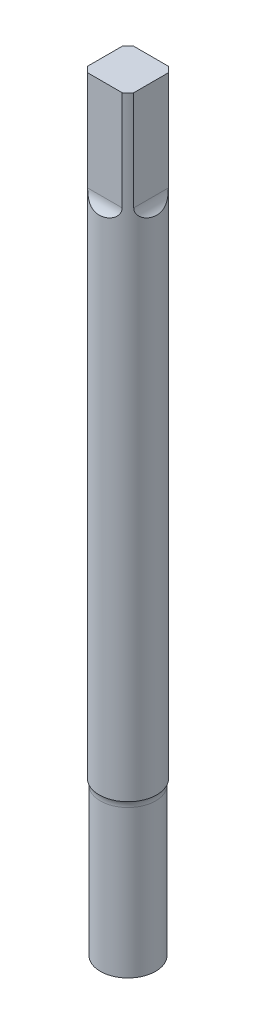
ISO-10303-21;
HEADER;
FILE_DESCRIPTION(('STEP AP214'),'2;1');
FILE_NAME('part.step','',(''),(''),'','','');
FILE_SCHEMA(('AUTOMOTIVE_DESIGN { 1 0 10303 214 1 1 1 1 }'));
ENDSEC;
DATA;
#1=APPLICATION_CONTEXT('core data for automotive mechanical design processes');
#2=APPLICATION_PROTOCOL_DEFINITION('international standard','automotive_design',2000,#1);
#3=PRODUCT_CONTEXT('',#1,'mechanical');
#4=PRODUCT('Part','Part','',(#3));
#5=PRODUCT_RELATED_PRODUCT_CATEGORY('part','',(#4));
#6=PRODUCT_DEFINITION_FORMATION('','',#4);
#7=PRODUCT_DEFINITION_CONTEXT('part definition',#1,'design');
#8=PRODUCT_DEFINITION('design','',#6,#7);
#9=PRODUCT_DEFINITION_SHAPE('','',#8);
#10=(LENGTH_UNIT() NAMED_UNIT(*) SI_UNIT(.MILLI.,.METRE.));
#11=(NAMED_UNIT(*) PLANE_ANGLE_UNIT() SI_UNIT($,.RADIAN.));
#12=(NAMED_UNIT(*) SI_UNIT($,.STERADIAN.) SOLID_ANGLE_UNIT());
#13=UNCERTAINTY_MEASURE_WITH_UNIT(LENGTH_MEASURE(1.E-05),#10,'distance_accuracy_value','');
#14=(GEOMETRIC_REPRESENTATION_CONTEXT(3) GLOBAL_UNCERTAINTY_ASSIGNED_CONTEXT((#13)) GLOBAL_UNIT_ASSIGNED_CONTEXT((#10,
#11,#12)) REPRESENTATION_CONTEXT('',''));
#15=CARTESIAN_POINT('',(0.,0.,0.));
#16=DIRECTION('',(0.,0.,1.));
#17=DIRECTION('',(1.,0.,0.));
#18=AXIS2_PLACEMENT_3D('',#15,#16,#17);
#19=CARTESIAN_POINT('',(-1.52655665885959E-13,-101.600000000001,0.));
#20=DIRECTION('',(0.,0.999999999999995,0.));
#21=DIRECTION('',(0.,0.,0.999999999999994));
#22=AXIS2_PLACEMENT_3D('',#19,#20,#21);
#23=CYLINDRICAL_SURFACE('',#22,4.7625);
#24=DIRECTION('',(0.,0.999999999999995,0.));
#25=VECTOR('',#24,1.);
#26=CARTESIAN_POINT('',(3.81000000000037,-101.599999999999,2.8574999999994));
#27=LINE('',#26,#25);
#28=CARTESIAN_POINT('',(3.81000000000195,4.16333634234434E-12,2.85749999999835));
#29=VERTEX_POINT('',#28);
#30=CARTESIAN_POINT('',(3.80999999999877,-16.510000000001,2.85749999999874));
#31=VERTEX_POINT('',#30);
#32=EDGE_CURVE('E178',#29,#31,#27,.F.);
#33=ORIENTED_EDGE('',*,*,#32,.F.);
#34=CARTESIAN_POINT('',(0.,0.,0.));
#35=DIRECTION('',(0.,0.999999999999995,0.));
#36=DIRECTION('',(0.,0.,0.999999999999994));
#37=AXIS2_PLACEMENT_3D('',#34,#35,#36);
#38=CIRCLE('',#37,4.7625);
#39=CARTESIAN_POINT('',(2.85749999999975,-2.77555756156289E-13,3.80999999999831));
#40=VERTEX_POINT('',#39);
#41=EDGE_CURVE('E145',#40,#29,#38,.T.);
#42=ORIENTED_EDGE('',*,*,#41,.F.);
#43=DIRECTION('',(0.,0.999999999999995,0.));
#44=VECTOR('',#43,1.);
#45=CARTESIAN_POINT('',(2.85749999999924,-101.6,3.80999999999904));
#46=LINE('',#45,#44);
#47=CARTESIAN_POINT('',(2.85749999999982,-16.5100000000001,3.81000000000004));
#48=VERTEX_POINT('',#47);
#49=EDGE_CURVE('E175',#48,#40,#46,.T.);
#50=ORIENTED_EDGE('',*,*,#49,.F.);
#51=CARTESIAN_POINT('',(2.85749999999982,-16.5100000000001,3.81000000000004));
#52=CARTESIAN_POINT('',(2.857504477416,-16.5570812641669,3.80998889247939));
#53=CARTESIAN_POINT('',(2.85575475834825,-16.6041575472771,3.81130874293111));
#54=CARTESIAN_POINT('',(2.84878240778673,-16.6978911993434,3.81652717100853));
#55=CARTESIAN_POINT('',(2.84356107098717,-16.7445487179003,3.82042478728745));
#56=CARTESIAN_POINT('',(2.82971803597565,-16.8368241429391,3.83068815279294));
#57=CARTESIAN_POINT('',(2.82111467374272,-16.882446275046,3.83704058987169));
#58=CARTESIAN_POINT('',(2.80058411548353,-16.9725362185548,3.85205088614253));
#59=CARTESIAN_POINT('',(2.78865679192644,-17.0170039855954,3.86070883378988));
#60=CARTESIAN_POINT('',(2.74803670210216,-17.148095208299,3.88983544368361));
#61=CARTESIAN_POINT('',(2.71448015022048,-17.232576406293,3.91347681240542));
#62=CARTESIAN_POINT('',(2.63547730925202,-17.3935415141389,3.96710566305349));
#63=CARTESIAN_POINT('',(2.59002163316283,-17.4700190430684,3.99709815167741));
#64=CARTESIAN_POINT('',(2.48813365815304,-17.6144514591364,4.06131136988517));
#65=CARTESIAN_POINT('',(2.43160037741213,-17.6823176829736,4.09556985252247));
#66=CARTESIAN_POINT('',(2.3094307174003,-17.8082889539501,4.16568000215951));
#67=CARTESIAN_POINT('',(2.24379161008309,-17.8663910642455,4.2015321444136));
#68=CARTESIAN_POINT('',(2.1225791340994,-17.9596258934155,4.26373886289992));
#69=CARTESIAN_POINT('',(2.06864738803728,-17.9968544750094,4.29020640349718));
#70=CARTESIAN_POINT('',(1.95721344300889,-18.0663194666636,4.34217852643301));
#71=CARTESIAN_POINT('',(1.89970987800982,-18.0985539500697,4.36768273427602));
#72=CARTESIAN_POINT('',(1.72242975744331,-18.1884107808562,4.44195724000351));
#73=CARTESIAN_POINT('',(1.59806065086234,-18.2390555435753,4.4883964231077));
#74=CARTESIAN_POINT('',(1.38489450345278,-18.3100971181266,4.55757618934135));
#75=CARTESIAN_POINT('',(1.2983430777971,-18.3349268359907,4.58301185432091));
#76=CARTESIAN_POINT('',(1.12246328205685,-18.3785692621857,4.62922574310534));
#77=CARTESIAN_POINT('',(1.03313379041925,-18.3973795048236,4.65000205731038));
#78=CARTESIAN_POINT('',(0.852638368672784,-18.4295877609794,4.68645810438564));
#79=CARTESIAN_POINT('',(0.761475219115703,-18.4429934031765,4.70214501487512));
#80=CARTESIAN_POINT('',(0.577855823978592,-18.4649235869099,4.72822175220419));
#81=CARTESIAN_POINT('',(0.485400190984095,-18.4734503655098,4.73861400651746));
#82=CARTESIAN_POINT('',(0.327396798143697,-18.4840898462187,4.75168378969452));
#83=CARTESIAN_POINT('',(0.262034196139407,-18.487356412568,4.75573706929774));
#84=CARTESIAN_POINT('',(0.1311172335869,-18.4917046459359,4.76114566370127));
#85=CARTESIAN_POINT('',(0.0655628466382996,-18.4927859964594,4.7625005876856));
#86=CARTESIAN_POINT('',(-0.108014055120613,-18.4927882945611,4.7624990317909));
#87=CARTESIAN_POINT('',(-0.216051071695446,-18.4898570581697,4.7588189076092));
#88=CARTESIAN_POINT('',(-0.431358801819971,-18.4779796748547,4.74415354679155));
#89=CARTESIAN_POINT('',(-0.538628954476402,-18.4690295060374,4.73316342561711));
#90=CARTESIAN_POINT('',(-0.75162904381935,-18.444628938568,4.70404269080407));
#91=CARTESIAN_POINT('',(-0.857356559797231,-18.4291692669451,4.68590189318812));
#92=CARTESIAN_POINT('',(-1.06601494560044,-18.3910048034972,4.64288511417884));
#93=CARTESIAN_POINT('',(-1.16894743498945,-18.3683043089281,4.61801312890844));
#94=CARTESIAN_POINT('',(-1.40769241509819,-18.3048244003388,4.55193436506253));
#95=CARTESIAN_POINT('',(-1.54189450629578,-18.2604742319646,4.5080746977329));
#96=CARTESIAN_POINT('',(-1.73472014064091,-18.18001768096,4.43586510863972));
#97=CARTESIAN_POINT('',(-1.79754152387835,-18.1509021262233,4.41074500504122));
#98=CARTESIAN_POINT('',(-1.919860722244,-18.0875838933927,4.35889270380213));
#99=CARTESIAN_POINT('',(-1.97935937798512,-18.0533825100498,4.33216091749083));
#100=CARTESIAN_POINT('',(-2.12555288862533,-17.9594702155585,4.26298189144815));
#101=CARTESIAN_POINT('',(-2.20955602255195,-17.895965882345,4.21985318770403));
#102=CARTESIAN_POINT('',(-2.36541694213501,-17.7549597236629,4.13450180594256));
#103=CARTESIAN_POINT('',(-2.4372873082592,-17.6774725716812,4.092278229568));
#104=CARTESIAN_POINT('',(-2.55586905469231,-17.5222061092004,4.01908116910294));
#105=CARTESIAN_POINT('',(-2.60476464435892,-17.4464419139193,3.98738722769704));
#106=CARTESIAN_POINT('',(-2.69053460712313,-17.2862352152797,3.93002591348936));
#107=CARTESIAN_POINT('',(-2.72741121598902,-17.2017943298055,3.90435742008383));
#108=CARTESIAN_POINT('',(-2.78539759302758,-17.0336176150615,3.86317583482228));
#109=CARTESIAN_POINT('',(-2.80756549945439,-16.950409874321,3.84699451596426));
#110=CARTESIAN_POINT('',(-2.84013531139345,-16.7806679238547,3.82301855081235));
#111=CARTESIAN_POINT('',(-2.85056244829104,-16.6941412623318,3.81520592163503));
#112=CARTESIAN_POINT('',(-2.85667547785698,-16.5748485672803,3.81061562883092));
#113=CARTESIAN_POINT('',(-2.85750568579378,-16.5424159955289,3.80998984431668));
#114=CARTESIAN_POINT('',(-2.85750000000046,-16.5099999999989,3.80999999999976));
#115=B_SPLINE_CURVE_WITH_KNOTS('',3,(#51,#52,#53,#54,#55,#56,#57,#58,#59,#60,#61,#62,#63,#64,
#65,#66,#67,#68,#69,#70,#71,#72,#73,#74,#75,#76,#77,#78,#79,#80,#81,#82,#83,#84,#85,#86,#87,#88,
#89,#90,#91,#92,#93,#94,#95,#96,#97,#98,#99,#100,#101,#102,#103,#104,#105,#106,#107,#108,#109,
#110,#111,#112,#113,#114),.UNSPECIFIED.,.F.,.F.,(4,2,2,2,2,2,2,2,2,2,2,2,2,2,2,2,2,2,2,2,2,2,2,
2,2,2,2,2,2,2,2,4),(0.,0.14118451266999,0.282316401941555,0.422693456200613,0.563075897064933,
0.843329389965566,1.1238046395233,1.40696677347145,1.69021392489678,1.90196181184655,
2.11379118587918,2.53815784700152,2.81856048269996,3.0990778301371,3.37919782481325,
3.65918927531442,3.85581011698062,4.05245943413083,4.37643698042298,4.70063122621408,
5.0252888666991,5.34975418798577,5.79186482315888,6.01261209991824,6.23330327470561,
6.57333338209456,6.91300871729004,7.19854355905399,7.48402525533128,7.74570724153362,
8.00682578286032,8.10410271681981),.UNSPECIFIED.);
#116=CARTESIAN_POINT('',(-2.85749999999894,-16.5099999999994,3.81000000000004));
#117=VERTEX_POINT('',#116);
#118=EDGE_CURVE('E51',#48,#117,#115,.T.);
#119=ORIENTED_EDGE('',*,*,#118,.T.);
#120=DIRECTION('',(0.,0.999999999999995,0.));
#121=VECTOR('',#120,1.);
#122=CARTESIAN_POINT('',(-2.85750000000008,-101.599999999999,3.81000000000059));
#123=LINE('',#122,#121);
#124=CARTESIAN_POINT('',(-2.85750000000118,2.22044604925031E-12,3.80999999999976));
#125=VERTEX_POINT('',#124);
#126=EDGE_CURVE('E172',#125,#117,#123,.F.);
#127=ORIENTED_EDGE('',*,*,#126,.F.);
#128=CARTESIAN_POINT('',(-3.81000000000042,-4.44089209850063E-13,2.85749999999796));
#129=VERTEX_POINT('',#128);
#130=EDGE_CURVE('E143',#129,#125,#38,.T.);
#131=ORIENTED_EDGE('',*,*,#130,.F.);
#132=DIRECTION('',(0.,0.999999999999995,0.));
#133=VECTOR('',#132,1.);
#134=CARTESIAN_POINT('',(-3.81000000000106,-101.600000000001,2.85749999999735));
#135=LINE('',#134,#133);
#136=CARTESIAN_POINT('',(-3.81000000000122,-16.5099999999989,2.85749999999779));
#137=VERTEX_POINT('',#136);
#138=EDGE_CURVE('E121',#137,#129,#135,.T.);
#139=ORIENTED_EDGE('',*,*,#138,.F.);
#140=CARTESIAN_POINT('',(-3.81000000000122,-16.5099999999989,2.85749999999779));
#141=CARTESIAN_POINT('',(-3.80998889248156,-16.5570812641658,2.85750447741345));
#142=CARTESIAN_POINT('',(-3.81130874293362,-16.6041575472763,2.85575475834562));
#143=CARTESIAN_POINT('',(-3.81652717101125,-16.6978911993434,2.84878240778408));
#144=CARTESIAN_POINT('',(-3.82042478729006,-16.7445487179007,2.84356107098459));
#145=CARTESIAN_POINT('',(-3.83068815279572,-16.8368241429402,2.82971803597266));
#146=CARTESIAN_POINT('',(-3.83704058987475,-16.8824462750473,2.82111467373928));
#147=CARTESIAN_POINT('',(-3.85205088614524,-16.972536218557,2.8005841154808));
#148=CARTESIAN_POINT('',(-3.86070883379195,-17.0170039855984,2.78865679192487));
#149=CARTESIAN_POINT('',(-3.8898354436849,-17.148095208302,2.74803670210157));
#150=CARTESIAN_POINT('',(-3.91347681240778,-17.2325764062941,2.71448015021708));
#151=CARTESIAN_POINT('',(-3.96710566305672,-17.3935415141395,2.635477309249));
#152=CARTESIAN_POINT('',(-3.99709815168043,-17.4700190430704,2.59002163316298));
#153=CARTESIAN_POINT('',(-4.06131136988785,-17.6144514591375,2.4881336581538));
#154=CARTESIAN_POINT('',(-4.095569852525,-17.6823176829722,2.43160037741027));
#155=CARTESIAN_POINT('',(-4.16568000216045,-17.8082889539491,2.30943071739817));
#156=CARTESIAN_POINT('',(-4.20153214441309,-17.8663910642475,2.24379161008331));
#157=CARTESIAN_POINT('',(-4.2637388628996,-17.9596258934167,2.12257913410001));
#158=CARTESIAN_POINT('',(-4.29020640349782,-17.9968544750084,2.06864738803683));
#159=CARTESIAN_POINT('',(-4.34217852643433,-18.066319466661,1.95721344300756));
#160=CARTESIAN_POINT('',(-4.36768273427704,-18.0985539500677,1.89970987800866));
#161=CARTESIAN_POINT('',(-4.44195724000436,-18.1884107808554,1.72242975744266));
#162=CARTESIAN_POINT('',(-4.48839642310944,-18.2390555435747,1.59806065086188));
#163=CARTESIAN_POINT('',(-4.55757618934283,-18.3100971181257,1.38489450345216));
#164=CARTESIAN_POINT('',(-4.58301185432182,-18.3349268359894,1.29834307779633));
#165=CARTESIAN_POINT('',(-4.62922574310589,-18.3785692621842,1.12246328205601));
#166=CARTESIAN_POINT('',(-4.65000205731115,-18.397379504822,1.03313379041849));
#167=CARTESIAN_POINT('',(-4.68645810438618,-18.4295877609783,0.852638368672071));
#168=CARTESIAN_POINT('',(-4.70214501487521,-18.4429934031758,0.761475219114955));
#169=CARTESIAN_POINT('',(-4.72822175220528,-18.464923586908,0.577855823977868));
#170=CARTESIAN_POINT('',(-4.73861400652,-18.4734503655066,0.485400190983433));
#171=CARTESIAN_POINT('',(-4.7516837896965,-18.4840898462157,0.327396798143045));
#172=CARTESIAN_POINT('',(-4.7557370692986,-18.4873564125659,0.262034196138715));
#173=CARTESIAN_POINT('',(-4.7611456637014,-18.4917046459355,0.131117233586171));
#174=CARTESIAN_POINT('',(-4.76250058768611,-18.4927859964597,0.0655628466375738));
#175=CARTESIAN_POINT('',(-4.76249903179182,-18.4927882945618,-0.108014055121045));
#176=CARTESIAN_POINT('',(-4.75881890760976,-18.4898570581689,-0.216051071695584));
#177=CARTESIAN_POINT('',(-4.74415354679187,-18.4779796748528,-0.43135880181972));
#178=CARTESIAN_POINT('',(-4.73316342561754,-18.4690295060361,-0.538628954476053));
#179=CARTESIAN_POINT('',(-4.70404269080461,-18.4446289385666,-0.751629043818743));
#180=CARTESIAN_POINT('',(-4.68590189318864,-18.4291692669432,-0.857356559796463));
#181=CARTESIAN_POINT('',(-4.64288511417945,-18.3910048034964,-1.06601494559964));
#182=CARTESIAN_POINT('',(-4.61801312890916,-18.368304308929,-1.16894743498878));
#183=CARTESIAN_POINT('',(-4.5519343650633,-18.3048244003407,-1.40769241509756));
#184=CARTESIAN_POINT('',(-4.50807469773355,-18.2604742319645,-1.54189450629477));
#185=CARTESIAN_POINT('',(-4.43586510864074,-18.1800176809578,-1.7347201406393));
#186=CARTESIAN_POINT('',(-4.41074500504244,-18.1509021262206,-1.79754152387656));
#187=CARTESIAN_POINT('',(-4.35889270380274,-18.0875838933921,-1.91986072224317));
#188=CARTESIAN_POINT('',(-4.33216091749061,-18.0533825100519,-1.97935937798544));
#189=CARTESIAN_POINT('',(-4.26298189144778,-17.9594702155619,-2.12555288862554));
#190=CARTESIAN_POINT('',(-4.21985318770539,-17.8959658823442,-2.20955602254925));
#191=CARTESIAN_POINT('',(-4.13450180594457,-17.7549597236615,-2.36541694213275));
#192=CARTESIAN_POINT('',(-4.09227822956893,-17.6774725716837,-2.43728730826026));
#193=CARTESIAN_POINT('',(-4.01908116910408,-17.5222061092031,-2.5558690546921));
#194=CARTESIAN_POINT('',(-3.98738722769912,-17.4464419139193,-2.60476464435528));
#195=CARTESIAN_POINT('',(-3.93002591349197,-17.2862352152789,-2.69053460712066));
#196=CARTESIAN_POINT('',(-3.90435742008604,-17.2017943298067,-2.72741121599114));
#197=CARTESIAN_POINT('',(-3.86317583482464,-17.033617615063,-2.78539759302906));
#198=CARTESIAN_POINT('',(-3.84699451596707,-16.9504098743213,-2.80756549945142));
#199=CARTESIAN_POINT('',(-3.8230185508147,-16.7806679238545,-2.84013531139018));
#200=CARTESIAN_POINT('',(-3.81520592163645,-16.6941412623324,-2.85056244829189));
#201=CARTESIAN_POINT('',(-3.81061562883205,-16.5748485672816,-2.85667547785939));
#202=CARTESIAN_POINT('',(-3.80998984431783,-16.5424159955305,-2.85750568579621));
#203=CARTESIAN_POINT('',(-3.81000000000109,-16.5100000000007,-2.85750000000212));
#204=B_SPLINE_CURVE_WITH_KNOTS('',3,(#140,#141,#142,#143,#144,#145,#146,#147,#148,#149,#150,
#151,#152,#153,#154,#155,#156,#157,#158,#159,#160,#161,#162,#163,#164,#165,#166,#167,#168,#169,
#170,#171,#172,#173,#174,#175,#176,#177,#178,#179,#180,#181,#182,#183,#184,#185,#186,#187,#188,
#189,#190,#191,#192,#193,#194,#195,#196,#197,#198,#199,#200,#201,#202,#203),.UNSPECIFIED.,.F.,
.F.,(4,2,2,2,2,2,2,2,2,2,2,2,2,2,2,2,2,2,2,2,2,2,2,2,2,2,2,2,2,2,2,4),(0.,0.141184512670662,
0.282316401943627,0.422693456203761,0.563075897068793,0.843329389968136,1.12380463952463,
1.40696677347191,1.69021392489637,1.9019618118459,2.11379118587883,2.53815784700135,
2.81856048269947,3.09907783013658,3.37919782481276,3.65918927531381,3.85581011698008,
4.05245943413033,4.3764369804217,4.7006312262124,5.02528886669725,5.34975418798315,
5.79186482315654,6.01261209991619,6.23330327470314,6.57333338209145,6.9130087172863,
7.19854355905055,7.48402525532821,7.74570724153052,8.00682578285707,8.10410271681566),.UNSPECIFIED.);
#205=CARTESIAN_POINT('',(-3.81000000000122,-16.5099999999976,-2.85749999999962));
#206=VERTEX_POINT('',#205);
#207=EDGE_CURVE('E133',#137,#206,#204,.T.);
#208=ORIENTED_EDGE('',*,*,#207,.T.);
#209=DIRECTION('',(0.,0.999999999999995,0.));
#210=VECTOR('',#209,1.);
#211=CARTESIAN_POINT('',(-3.81000000000184,-101.599999999997,-2.85749999999974));
#212=LINE('',#211,#210);
#213=CARTESIAN_POINT('',(-3.81000000000031,0.,-2.8574999999999));
#214=VERTEX_POINT('',#213);
#215=EDGE_CURVE('E118',#214,#206,#212,.F.);
#216=ORIENTED_EDGE('',*,*,#215,.F.);
#217=CARTESIAN_POINT('',(-2.85749999999962,8.88178419700125E-13,-3.8100000000012));
#218=VERTEX_POINT('',#217);
#219=EDGE_CURVE('E132',#218,#214,#38,.T.);
#220=ORIENTED_EDGE('',*,*,#219,.F.);
#221=DIRECTION('',(0.,0.999999999999995,0.));
#222=VECTOR('',#221,1.);
#223=CARTESIAN_POINT('',(-2.8574999999995,-101.599999999997,-3.81000000000087));
#224=LINE('',#223,#222);
#225=CARTESIAN_POINT('',(-2.85749999999839,-16.5099999999998,-3.81000000000181));
#226=VERTEX_POINT('',#225);
#227=EDGE_CURVE('E169',#226,#218,#224,.T.);
#228=ORIENTED_EDGE('',*,*,#227,.F.);
#229=CARTESIAN_POINT('',(-2.85749999999839,-16.5099999999998,-3.81000000000181));
#230=CARTESIAN_POINT('',(-2.8575044774136,-16.5570812641663,-3.80998889248185));
#231=CARTESIAN_POINT('',(-2.85575475834566,-16.6041575472763,-3.81130874293376));
#232=CARTESIAN_POINT('',(-2.84878240778415,-16.6978911993426,-3.81652717101124));
#233=CARTESIAN_POINT('',(-2.84356107098478,-16.7445487178997,-3.82042478729005));
#234=CARTESIAN_POINT('',(-2.82971803597287,-16.8368241429385,-3.83068815279565));
#235=CARTESIAN_POINT('',(-2.82111467373938,-16.8824462750453,-3.83704058987461));
#236=CARTESIAN_POINT('',(-2.80058411548158,-16.9725362185547,-3.85205088614493));
#237=CARTESIAN_POINT('',(-2.78865679192646,-17.017003985596,-3.86070883379151));
#238=CARTESIAN_POINT('',(-2.74803670210382,-17.1480952083001,-3.88983544368444));
#239=CARTESIAN_POINT('',(-2.71448015021766,-17.2325764062923,-3.91347681240762));
#240=CARTESIAN_POINT('',(-2.63547730924902,-17.3935415141392,-3.96710566305663));
#241=CARTESIAN_POINT('',(-2.59002163316413,-17.4700190430718,-3.99709815168011));
#242=CARTESIAN_POINT('',(-2.48813365815478,-17.614451459139,-4.06131136988719));
#243=CARTESIAN_POINT('',(-2.43160037741002,-17.6823176829724,-4.09556985252423));
#244=CARTESIAN_POINT('',(-2.30943071739812,-17.8082889539481,-4.16568000216145));
#245=CARTESIAN_POINT('',(-2.24379161008469,-17.8663910642465,-4.20153214441599));
#246=CARTESIAN_POINT('',(-2.1225791341015,-17.9596258934159,-4.26373886290172));
#247=CARTESIAN_POINT('',(-2.06864738803757,-17.9968544750078,-4.29020640349829));
#248=CARTESIAN_POINT('',(-1.95721344300748,-18.0663194666601,-4.34217852643351));
#249=CARTESIAN_POINT('',(-1.8997098780085,-18.0985539500664,-4.36768273427656));
#250=CARTESIAN_POINT('',(-1.72242975744362,-18.188410780856,-4.44195724000492));
#251=CARTESIAN_POINT('',(-1.59806065086522,-18.2390555435808,-4.48839642311081));
#252=CARTESIAN_POINT('',(-1.3848945034552,-18.3100971181297,-4.55757618934345));
#253=CARTESIAN_POINT('',(-1.29834307779819,-18.3349268359897,-4.5830118543216));
#254=CARTESIAN_POINT('',(-1.12246328205697,-18.378569262182,-4.62922574310514));
#255=CARTESIAN_POINT('',(-1.03313379041971,-18.3973795048211,-4.65000205731069));
#256=CARTESIAN_POINT('',(-0.852638368673192,-18.4295877609775,-4.68645810438588));
#257=CARTESIAN_POINT('',(-0.761475219115704,-18.4429934031739,-4.70214501487477));
#258=CARTESIAN_POINT('',(-0.577855823978611,-18.4649235869084,-4.72822175220517));
#259=CARTESIAN_POINT('',(-0.485400190984543,-18.4734503655103,-4.73861400652037));
#260=CARTESIAN_POINT('',(-0.327396798144469,-18.4840898462183,-4.75168378969643));
#261=CARTESIAN_POINT('',(-0.262034196140251,-18.487356412566,-4.755737069298));
#262=CARTESIAN_POINT('',(-0.131117233588161,-18.4917046459339,-4.76114566370143));
#263=CARTESIAN_POINT('',(-0.0655628466399042,-18.4927859964589,-4.76250058768731));
#264=CARTESIAN_POINT('',(0.108014055118458,-18.492788294562,-4.76249903179396));
#265=CARTESIAN_POINT('',(0.216051071693117,-18.4898570581685,-4.75881890761024));
#266=CARTESIAN_POINT('',(0.431358801817656,-18.4779796748521,-4.74415354679117));
#267=CARTESIAN_POINT('',(0.538628954474272,-18.4690295060355,-4.7331634256173));
#268=CARTESIAN_POINT('',(0.751629043817416,-18.444628938566,-4.7040426908047));
#269=CARTESIAN_POINT('',(0.85735655979531,-18.4291692669423,-4.68590189318862));
#270=CARTESIAN_POINT('',(1.06601494559893,-18.391004803496,-4.64288511417921));
#271=CARTESIAN_POINT('',(1.16894743498835,-18.3683043089294,-4.61801312890883));
#272=CARTESIAN_POINT('',(1.40769241509727,-18.3048244003412,-4.55193436506311));
#273=CARTESIAN_POINT('',(1.54189450629422,-18.2604742319637,-4.50807469773372));
#274=CARTESIAN_POINT('',(1.73472014063872,-18.180017680957,-4.43586510864036));
#275=CARTESIAN_POINT('',(1.79754152387605,-18.1509021262202,-4.41074500504171));
#276=CARTESIAN_POINT('',(1.91986072224276,-18.0875838933909,-4.35889270380302));
#277=CARTESIAN_POINT('',(1.97935937798507,-18.0533825100495,-4.33216091749228));
#278=CARTESIAN_POINT('',(2.12555288862503,-17.959470215559,-4.26298189145026));
#279=CARTESIAN_POINT('',(2.2095560225486,-17.8959658823429,-4.21985318770578));
#280=CARTESIAN_POINT('',(2.3654169421319,-17.7549597236614,-4.13450180594403));
#281=CARTESIAN_POINT('',(2.43728730825936,-17.6774725716832,-4.09227822956956));
#282=CARTESIAN_POINT('',(2.5558690546913,-17.5222061092023,-4.01908116910495));
#283=CARTESIAN_POINT('',(2.60476464435459,-17.4464419139185,-3.98738722769937));
#284=CARTESIAN_POINT('',(2.69053460711994,-17.286235215278,-3.93002591349158));
#285=CARTESIAN_POINT('',(2.72741121599029,-17.2017943298055,-3.90435742008562));
#286=CARTESIAN_POINT('',(2.78539759302831,-17.0336176150618,-3.86317583482403));
#287=CARTESIAN_POINT('',(2.80756549945089,-16.9504098743202,-3.84699451596631));
#288=CARTESIAN_POINT('',(2.84013531138921,-16.7806679238534,-3.82301855081543));
#289=CARTESIAN_POINT('',(2.85056244829024,-16.6941412623311,-3.81520592163884));
#290=CARTESIAN_POINT('',(2.85667547785765,-16.5748485672805,-3.81061562883386));
#291=CARTESIAN_POINT('',(2.85750568579453,-16.5424159955298,-3.80998984431919));
#292=CARTESIAN_POINT('',(2.85750000000067,-16.5100000000002,-3.81000000000153));
#293=B_SPLINE_CURVE_WITH_KNOTS('',3,(#229,#230,#231,#232,#233,#234,#235,#236,#237,#238,#239,
#240,#241,#242,#243,#244,#245,#246,#247,#248,#249,#250,#251,#252,#253,#254,#255,#256,#257,#258,
#259,#260,#261,#262,#263,#264,#265,#266,#267,#268,#269,#270,#271,#272,#273,#274,#275,#276,#277,
#278,#279,#280,#281,#282,#283,#284,#285,#286,#287,#288,#289,#290,#291,#292),.UNSPECIFIED.,.F.,
.F.,(4,2,2,2,2,2,2,2,2,2,2,2,2,2,2,2,2,2,2,2,2,2,2,2,2,2,2,2,2,2,2,4),(0.,0.141184512669339,
0.28231640194129,0.422693456200655,0.563075897064767,0.843329389966329,1.12380463952474,
1.40696677347117,1.6902139248951,1.90196181184451,2.11379118587779,2.53815784700004,
2.81856048269762,3.09907783013512,3.37919782481191,3.65918927531282,3.85581011697828,
4.05245943412768,4.37643698041942,4.70063122621092,5.02528886669642,5.34975418798266,
5.79186482315613,6.01261209991593,6.23330327470307,6.57333338209071,6.91300871728491,
7.19854355904996,7.48402525532813,7.74570724153005,8.00682578285662,8.10410271681435),.UNSPECIFIED.);
#294=CARTESIAN_POINT('',(2.85750000000067,-16.5100000000002,-3.81000000000153));
#295=VERTEX_POINT('',#294);
#296=EDGE_CURVE('E221',#226,#295,#293,.T.);
#297=ORIENTED_EDGE('',*,*,#296,.T.);
#298=DIRECTION('',(0.,0.999999999999995,0.));
#299=VECTOR('',#298,1.);
#300=CARTESIAN_POINT('',(2.85749999999832,-101.6,-3.81000000000165));
#301=LINE('',#300,#299);
#302=CARTESIAN_POINT('',(2.85749999999939,4.44089209850063E-13,-3.81000000000176));
#303=VERTEX_POINT('',#302);
#304=EDGE_CURVE('E149',#303,#295,#301,.F.);
#305=ORIENTED_EDGE('',*,*,#304,.F.);
#306=CARTESIAN_POINT('',(3.8099999999983,8.88178419700125E-13,-2.85749999999962));
#307=VERTEX_POINT('',#306);
#308=EDGE_CURVE('E142',#307,#303,#38,.T.);
#309=ORIENTED_EDGE('',*,*,#308,.F.);
#310=DIRECTION('',(0.,0.999999999999995,0.));
#311=VECTOR('',#310,1.);
#312=CARTESIAN_POINT('',(3.80999999999995,-101.599999999999,-2.85749999999957));
#313=LINE('',#312,#311);
#314=CARTESIAN_POINT('',(3.81000000000026,-16.5100000000002,-2.85750000000007));
#315=VERTEX_POINT('',#314);
#316=EDGE_CURVE('E135',#315,#307,#313,.T.);
#317=ORIENTED_EDGE('',*,*,#316,.F.);
#318=CARTESIAN_POINT('',(3.81000000000026,-16.5100000000002,-2.85750000000007));
#319=CARTESIAN_POINT('',(3.80998889248029,-16.5570812641669,-2.85750447741493));
#320=CARTESIAN_POINT('',(3.81130874293226,-16.6041575472772,-2.85575475834682));
#321=CARTESIAN_POINT('',(3.81652717100984,-16.6978911993438,-2.84878240778516));
#322=CARTESIAN_POINT('',(3.82042478728869,-16.744548717901,-2.84356107098581));
#323=CARTESIAN_POINT('',(3.83068815279421,-16.8368241429402,-2.82971803597391));
#324=CARTESIAN_POINT('',(3.83704058987307,-16.8824462750473,-2.82111467374041));
#325=CARTESIAN_POINT('',(3.85205088614395,-16.9725362185571,-2.8005841154823));
#326=CARTESIAN_POINT('',(3.86070883379121,-17.0170039855984,-2.78865679192687));
#327=CARTESIAN_POINT('',(3.88983544368493,-17.1480952083025,-2.74803670210389));
#328=CARTESIAN_POINT('',(3.91347681240708,-17.2325764062947,-2.71448015021812));
#329=CARTESIAN_POINT('',(3.9671056630551,-17.3935415141415,-2.63547730924981));
#330=CARTESIAN_POINT('',(3.99709815167861,-17.4700190430737,-2.59002163316488));
#331=CARTESIAN_POINT('',(4.06131136988569,-17.6144514591406,-2.48813365815595));
#332=CARTESIAN_POINT('',(4.09556985252267,-17.6823176829742,-2.43160037741167));
#333=CARTESIAN_POINT('',(4.16568000216008,-17.8082889539486,-2.30943071739951));
#334=CARTESIAN_POINT('',(4.20153214441486,-17.8663910642455,-2.24379161008533));
#335=CARTESIAN_POINT('',(4.26373886290044,-17.9596258934152,-2.12257913410253));
#336=CARTESIAN_POINT('',(4.2902064034968,-17.9968544750082,-2.06864738803926));
#337=CARTESIAN_POINT('',(4.34217852643189,-18.0663194666618,-1.95721344301004));
#338=CARTESIAN_POINT('',(4.36768273427504,-18.0985539500684,-1.89970987801127));
#339=CARTESIAN_POINT('',(4.44195724000323,-18.1884107808551,-1.72242975744542));
#340=CARTESIAN_POINT('',(4.48839642310832,-18.239055543573,-1.59806065086434));
#341=CARTESIAN_POINT('',(4.55757618934153,-18.3100971181247,-1.38489450345487));
#342=CARTESIAN_POINT('',(4.58301185432041,-18.3349268359896,-1.29834307779928));
#343=CARTESIAN_POINT('',(4.62922574310446,-18.3785692621853,-1.12246328205909));
#344=CARTESIAN_POINT('',(4.65000205730981,-18.397379504823,-1.03313379042147));
#345=CARTESIAN_POINT('',(4.68645810438506,-18.429587760979,-0.852638368674883));
#346=CARTESIAN_POINT('',(4.70214501487422,-18.4429934031764,-0.761475219117701));
#347=CARTESIAN_POINT('',(4.7282217522042,-18.4649235869094,-0.577855823980477));
#348=CARTESIAN_POINT('',(4.73861400651872,-18.4734503655086,-0.485400190985969));
#349=CARTESIAN_POINT('',(4.75168378969501,-18.4840898462177,-0.327396798145502));
#350=CARTESIAN_POINT('',(4.75573706929707,-18.4873564125675,-0.262034196141177));
#351=CARTESIAN_POINT('',(4.76114566370137,-18.4917046459363,-0.131117233588706));
#352=CARTESIAN_POINT('',(4.76250058768762,-18.4927859964601,-0.0655628466401766));
#353=CARTESIAN_POINT('',(4.76249903179444,-18.492788294562,0.108014055118472));
#354=CARTESIAN_POINT('',(4.75881890761005,-18.48985705817,0.216051071693121));
#355=CARTESIAN_POINT('',(4.7441535467905,-18.4779796748545,0.431358801817449));
#356=CARTESIAN_POINT('',(4.73316342561683,-18.4690295060373,0.538628954473866));
#357=CARTESIAN_POINT('',(4.70404269080441,-18.4446289385683,0.751629043817159));
#358=CARTESIAN_POINT('',(4.68590189318828,-18.4291692669458,0.857356559795395));
#359=CARTESIAN_POINT('',(4.64288511417876,-18.3910048034968,1.06601494559872));
#360=CARTESIAN_POINT('',(4.6180131289083,-18.3683043089263,1.16894743498749));
#361=CARTESIAN_POINT('',(4.55193436506246,-18.3048244003367,1.40769241509653));
#362=CARTESIAN_POINT('',(4.50807469773303,-18.2604742319646,1.54189450629501));
#363=CARTESIAN_POINT('',(4.43586510863967,-18.1800176809596,1.73472014063965));
#364=CARTESIAN_POINT('',(4.41074500504104,-18.1509021262223,1.79754152387659));
#365=CARTESIAN_POINT('',(4.35889270380256,-18.0875838933932,1.91986072224317));
#366=CARTESIAN_POINT('',(4.33216091749199,-18.0533825100526,1.97935937798572));
#367=CARTESIAN_POINT('',(4.26298189144995,-17.9594702155626,2.12555288862626));
#368=CARTESIAN_POINT('',(4.21985318770511,-17.8959658823459,2.20955602254989));
#369=CARTESIAN_POINT('',(4.13450180594312,-17.7549597236628,2.36541694213232));
#370=CARTESIAN_POINT('',(4.09227822956874,-17.6774725716834,2.43728730825887));
#371=CARTESIAN_POINT('',(4.0190811691038,-17.5222061092029,2.55586905469174));
#372=CARTESIAN_POINT('',(3.98738722769788,-17.4464419139203,2.60476464435648));
#373=CARTESIAN_POINT('',(3.93002591349056,-17.2862352152796,2.69053460712091));
#374=CARTESIAN_POINT('',(3.90435742008544,-17.2017943298059,2.72741121598887));
#375=CARTESIAN_POINT('',(3.86317583482367,-17.0336176150618,2.78539759302696));
#376=CARTESIAN_POINT('',(3.84699451596508,-16.9504098743209,2.80756549945159));
#377=CARTESIAN_POINT('',(3.82301855081367,-16.7806679238544,2.84013531139179));
#378=CARTESIAN_POINT('',(3.81520592163739,-16.694141262332,2.85056244829269));
#379=CARTESIAN_POINT('',(3.81061562883181,-16.5748485672812,2.85667547785771));
#380=CARTESIAN_POINT('',(3.80998984431687,-16.5424159955305,2.85750568579372));
#381=CARTESIAN_POINT('',(3.80999999999877,-16.510000000001,2.85749999999874));
#382=B_SPLINE_CURVE_WITH_KNOTS('',3,(#318,#319,#320,#321,#322,#323,#324,#325,#326,#327,#328,
#329,#330,#331,#332,#333,#334,#335,#336,#337,#338,#339,#340,#341,#342,#343,#344,#345,#346,#347,
#348,#349,#350,#351,#352,#353,#354,#355,#356,#357,#358,#359,#360,#361,#362,#363,#364,#365,#366,
#367,#368,#369,#370,#371,#372,#373,#374,#375,#376,#377,#378,#379,#380,#381),.UNSPECIFIED.,.F.,
.F.,(4,2,2,2,2,2,2,2,2,2,2,2,2,2,2,2,2,2,2,2,2,2,2,2,2,2,2,2,2,2,2,4),(0.,0.14118451266995,
0.282316401942349,0.42269345620248,0.563075897067425,0.843329389968335,1.12380463952594,
1.40696677347158,1.69021392489473,1.90196181184425,2.11379118587708,2.53815784699905,
2.81856048269742,3.09907783013467,3.37919782481115,3.65918927531248,3.85581011697871,
4.05245943412882,4.37643698042053,4.70063122621161,5.02528886669739,5.34975418798448,
5.79186482315769,6.01261209991686,6.23330327470358,6.57333338209216,6.91300871728739,
7.19854355905195,7.48402525533008,7.74570724153256,8.00682578285907,8.10410271681676),.UNSPECIFIED.);
#383=EDGE_CURVE('E79',#315,#31,#382,.T.);
#384=ORIENTED_EDGE('',*,*,#383,.T.);
#385=EDGE_LOOP('',(#33,#42,#50,#119,#127,#131,#139,#208,#216,#220,#228,#297,#305,#309,#317,#384));
#386=FACE_BOUND('',#385,.T.);
#387=CARTESIAN_POINT('',(-1.52655665885959E-13,-101.600000000001,0.));
#388=DIRECTION('',(0.,0.999999999999995,0.));
#389=DIRECTION('',(0.,0.,0.999999999999994));
#390=AXIS2_PLACEMENT_3D('',#387,#388,#389);
#391=CIRCLE('',#390,4.7625);
#392=CARTESIAN_POINT('',(-1.57414359325259E-13,-101.600000000001,4.76249999999991));
#393=VERTEX_POINT('',#392);
#394=EDGE_CURVE('E154',#393,#393,#391,.T.);
#395=ORIENTED_EDGE('',*,*,#394,.T.);
#396=EDGE_LOOP('',(#395));
#397=FACE_BOUND('',#396,.T.);
#398=ADVANCED_FACE('F42',(#386,#397),#23,.T.);
#399=CARTESIAN_POINT('',(0.,0.,0.));
#400=DIRECTION('',(0.,0.999999999999995,0.));
#401=DIRECTION('',(0.,0.,0.999999999999994));
#402=AXIS2_PLACEMENT_3D('',#399,#400,#401);
#403=PLANE('',#402);
#404=DIRECTION('',(0.,0.,0.999999999999994));
#405=VECTOR('',#404,1.);
#406=CARTESIAN_POINT('',(3.81000000000083,2.22044604925031E-12,-1.16573417585641E-12));
#407=LINE('',#406,#405);
#408=EDGE_CURVE('E126',#307,#29,#407,.T.);
#409=ORIENTED_EDGE('',*,*,#408,.F.);
#410=ORIENTED_EDGE('',*,*,#308,.T.);
#411=DIRECTION('',(0.999999999999993,0.,0.));
#412=VECTOR('',#411,1.);
#413=CARTESIAN_POINT('',(1.11022302462516E-13,8.88178419700125E-13,-3.81000000000031));
#414=LINE('',#413,#412);
#415=EDGE_CURVE('E127',#218,#303,#414,.T.);
#416=ORIENTED_EDGE('',*,*,#415,.F.);
#417=ORIENTED_EDGE('',*,*,#219,.T.);
#418=DIRECTION('',(0.,0.,-0.999999999999994));
#419=VECTOR('',#418,1.);
#420=CARTESIAN_POINT('',(-3.81000000000047,1.33226762955019E-12,-6.66133814775094E-13));
#421=LINE('',#420,#419);
#422=EDGE_CURVE('E114',#129,#214,#421,.T.);
#423=ORIENTED_EDGE('',*,*,#422,.F.);
#424=ORIENTED_EDGE('',*,*,#130,.T.);
#425=DIRECTION('',(-0.999999999999993,0.,0.));
#426=VECTOR('',#425,1.);
#427=CARTESIAN_POINT('',(-4.85722573273506E-13,1.77635683940025E-12,3.81000000000048));
#428=LINE('',#427,#426);
#429=EDGE_CURVE('E160',#40,#125,#428,.T.);
#430=ORIENTED_EDGE('',*,*,#429,.F.);
#431=ORIENTED_EDGE('',*,*,#41,.T.);
#432=EDGE_LOOP('',(#409,#410,#416,#417,#423,#424,#430,#431));
#433=FACE_BOUND('',#432,.T.);
#434=ADVANCED_FACE('F139',(#433),#403,.T.);
#435=CARTESIAN_POINT('',(5.27093123657797,-19.0500000000007,3.8099999999992));
#436=DIRECTION('',(0.,0.,-0.999999999999993));
#437=DIRECTION('',(-0.999999999999993,0.,0.));
#438=AXIS2_PLACEMENT_3D('',#435,#436,#437);
#439=PLANE('',#438);
#440=ORIENTED_EDGE('',*,*,#126,.T.);
#441=DIRECTION('',(-0.999999999999993,0.,0.));
#442=VECTOR('',#441,1.);
#443=CARTESIAN_POINT('',(2.85749999999982,-16.5100000000001,3.81000000000004));
#444=LINE('',#443,#442);
#445=EDGE_CURVE('E265',#117,#48,#444,.F.);
#446=ORIENTED_EDGE('',*,*,#445,.T.);
#447=ORIENTED_EDGE('',*,*,#49,.T.);
#448=ORIENTED_EDGE('',*,*,#429,.T.);
#449=EDGE_LOOP('',(#440,#446,#447,#448));
#450=FACE_BOUND('',#449,.T.);
#451=ADVANCED_FACE('F210',(#450),#439,.F.);
#452=CARTESIAN_POINT('',(-5.27093123657936,-19.0499999999982,-3.81000000000109));
#453=DIRECTION('',(0.,0.,0.999999999999994));
#454=DIRECTION('',(0.999999999999993,0.,0.));
#455=AXIS2_PLACEMENT_3D('',#452,#453,#454);
#456=PLANE('',#455);
#457=ORIENTED_EDGE('',*,*,#304,.T.);
#458=DIRECTION('',(0.999999999999993,0.,0.));
#459=VECTOR('',#458,1.);
#460=CARTESIAN_POINT('',(-2.85749999999839,-16.5099999999998,-3.81000000000181));
#461=LINE('',#460,#459);
#462=EDGE_CURVE('E262',#295,#226,#461,.F.);
#463=ORIENTED_EDGE('',*,*,#462,.T.);
#464=ORIENTED_EDGE('',*,*,#227,.T.);
#465=ORIENTED_EDGE('',*,*,#415,.T.);
#466=EDGE_LOOP('',(#457,#463,#464,#465));
#467=FACE_BOUND('',#466,.T.);
#468=ADVANCED_FACE('F267',(#467),#456,.F.);
#469=CARTESIAN_POINT('',(-3.81000000000174,-19.0500000000009,3.8100000000002));
#470=DIRECTION('',(0.999999999999993,0.,0.));
#471=DIRECTION('',(0.,0.,-0.999999999999994));
#472=AXIS2_PLACEMENT_3D('',#469,#470,#471);
#473=PLANE('',#472);
#474=ORIENTED_EDGE('',*,*,#215,.T.);
#475=DIRECTION('',(0.,0.,-0.999999999999994));
#476=VECTOR('',#475,1.);
#477=CARTESIAN_POINT('',(-3.81000000000122,-16.5099999999989,2.85749999999779));
#478=LINE('',#477,#476);
#479=EDGE_CURVE('E274',#206,#137,#478,.F.);
#480=ORIENTED_EDGE('',*,*,#479,.T.);
#481=ORIENTED_EDGE('',*,*,#138,.T.);
#482=ORIENTED_EDGE('',*,*,#422,.T.);
#483=EDGE_LOOP('',(#474,#480,#481,#482));
#484=FACE_BOUND('',#483,.T.);
#485=ADVANCED_FACE('F116',(#484),#473,.F.);
#486=CARTESIAN_POINT('',(3.81000000000005,-19.0500000000018,-3.81000000000253));
#487=DIRECTION('',(-0.999999999999993,0.,0.));
#488=DIRECTION('',(0.,0.,0.999999999999994));
#489=AXIS2_PLACEMENT_3D('',#486,#487,#488);
#490=PLANE('',#489);
#491=ORIENTED_EDGE('',*,*,#32,.T.);
#492=DIRECTION('',(0.,0.,0.999999999999994));
#493=VECTOR('',#492,1.);
#494=CARTESIAN_POINT('',(3.81000000000026,-16.5100000000002,-2.85750000000007));
#495=LINE('',#494,#493);
#496=EDGE_CURVE('E269',#31,#315,#495,.F.);
#497=ORIENTED_EDGE('',*,*,#496,.T.);
#498=ORIENTED_EDGE('',*,*,#316,.T.);
#499=ORIENTED_EDGE('',*,*,#408,.T.);
#500=EDGE_LOOP('',(#491,#497,#498,#499));
#501=FACE_BOUND('',#500,.T.);
#502=ADVANCED_FACE('F254',(#501),#490,.F.);
#503=CARTESIAN_POINT('',(-5.55111512312578E-13,-16.5100000000007,-6.35000000000213));
#504=DIRECTION('',(-0.999999999999993,0.,0.));
#505=DIRECTION('',(0.,0.,0.999999999999994));
#506=AXIS2_PLACEMENT_3D('',#503,#504,#505);
#507=CYLINDRICAL_SURFACE('',#506,2.54);
#508=ORIENTED_EDGE('',*,*,#296,.F.);
#509=ORIENTED_EDGE('',*,*,#462,.F.);
#510=EDGE_LOOP('',(#508,#509));
#511=FACE_BOUND('',#510,.T.);
#512=ADVANCED_FACE('F215',(#511),#507,.F.);
#513=CARTESIAN_POINT('',(6.35000000000069,-16.5100000000019,-4.44089209850063E-13));
#514=DIRECTION('',(0.,0.,-0.999999999999994));
#515=DIRECTION('',(-0.999999999999993,0.,0.));
#516=AXIS2_PLACEMENT_3D('',#513,#514,#515);
#517=CYLINDRICAL_SURFACE('',#516,2.54);
#518=ORIENTED_EDGE('',*,*,#383,.F.);
#519=ORIENTED_EDGE('',*,*,#496,.F.);
#520=EDGE_LOOP('',(#518,#519));
#521=FACE_BOUND('',#520,.T.);
#522=ADVANCED_FACE('F246',(#521),#517,.F.);
#523=CARTESIAN_POINT('',(-6.35000000000206,-16.5100000000011,-1.11022302462516E-12));
#524=DIRECTION('',(0.,0.,0.999999999999994));
#525=DIRECTION('',(0.999999999999993,0.,0.));
#526=AXIS2_PLACEMENT_3D('',#523,#524,#525);
#527=CYLINDRICAL_SURFACE('',#526,2.54);
#528=ORIENTED_EDGE('',*,*,#207,.F.);
#529=ORIENTED_EDGE('',*,*,#479,.F.);
#530=EDGE_LOOP('',(#528,#529));
#531=FACE_BOUND('',#530,.T.);
#532=ADVANCED_FACE('F203',(#531),#527,.F.);
#533=CARTESIAN_POINT('',(-9.43689570931383E-13,-16.5100000000007,6.34999999999941));
#534=DIRECTION('',(0.999999999999993,0.,0.));
#535=DIRECTION('',(0.,0.,-0.999999999999994));
#536=AXIS2_PLACEMENT_3D('',#533,#534,#535);
#537=CYLINDRICAL_SURFACE('',#536,2.54);
#538=ORIENTED_EDGE('',*,*,#118,.F.);
#539=ORIENTED_EDGE('',*,*,#445,.F.);
#540=EDGE_LOOP('',(#538,#539));
#541=FACE_BOUND('',#540,.T.);
#542=ADVANCED_FACE('F195',(#541),#537,.F.);
#543=CARTESIAN_POINT('',(1.80411241501588E-13,-127.,-1.11022302462516E-13));
#544=DIRECTION('',(0.,0.999999999999995,0.));
#545=DIRECTION('',(0.,0.,0.999999999999994));
#546=AXIS2_PLACEMENT_3D('',#543,#544,#545);
#547=CYLINDRICAL_SURFACE('',#546,4.572);
#548=CARTESIAN_POINT('',(1.55431223447522E-12,-102.565116443751,-1.22124532708767E-12));
#549=DIRECTION('',(0.,0.999999999999995,0.));
#550=DIRECTION('',(0.,0.,0.999999999999994));
#551=AXIS2_PLACEMENT_3D('',#548,#549,#550);
#552=CIRCLE('',#551,4.572);
#553=CARTESIAN_POINT('',(1.20156174383448E-13,-102.565116443751,4.57199999999984));
#554=VERTEX_POINT('',#553);
#555=EDGE_CURVE('E11',#554,#554,#552,.F.);
#556=CARTESIAN_POINT('',(1.80411241501588E-13,-127.,-1.11022302462516E-13));
#557=DIRECTION('',(0.,-0.999999999999995,0.));
#558=DIRECTION('',(0.,0.,-0.999999999999994));
#559=AXIS2_PLACEMENT_3D('',#556,#557,#558);
#560=CIRCLE('',#559,4.572);
#561=CARTESIAN_POINT('',(1.7584289579986E-13,-127.,4.57199999999986));
#562=VERTEX_POINT('',#561);
#563=EDGE_CURVE('E185',#562,#562,#560,.T.);
#564=CARTESIAN_POINT('',(1.20156174383448E-13,-102.565116443751,4.57199999999984));
#565=CARTESIAN_POINT('',(1.20736244398202E-13,-102.819646480795,4.57199999999985));
#566=CARTESIAN_POINT('',(1.21316314412957E-13,-103.074176517839,4.57199999999985));
#567=CARTESIAN_POINT('',(1.22476454442465E-13,-103.583236591928,4.57199999999985));
#568=CARTESIAN_POINT('',(1.23056524457219E-13,-103.837766628972,4.57199999999985));
#569=CARTESIAN_POINT('',(1.24216664486728E-13,-104.346826703061,4.57199999999985));
#570=CARTESIAN_POINT('',(1.24796734501482E-13,-104.601356740105,4.57199999999985));
#571=CARTESIAN_POINT('',(1.25956874530991E-13,-105.110416814193,4.57199999999985));
#572=CARTESIAN_POINT('',(1.26536944545745E-13,-105.364946851238,4.57199999999985));
#573=CARTESIAN_POINT('',(1.27697084575254E-13,-105.874006925326,4.57199999999985));
#574=CARTESIAN_POINT('',(1.28277154590008E-13,-106.128536962371,4.57199999999985));
#575=CARTESIAN_POINT('',(1.29437294619517E-13,-106.637597036459,4.57199999999985));
#576=CARTESIAN_POINT('',(1.30017364634271E-13,-106.892127073503,4.57199999999985));
#577=CARTESIAN_POINT('',(1.3117750466378E-13,-107.401187147592,4.57199999999985));
#578=CARTESIAN_POINT('',(1.31757574678534E-13,-107.655717184636,4.57199999999985));
#579=CARTESIAN_POINT('',(1.32917714708042E-13,-108.164777258725,4.57199999999985));
#580=CARTESIAN_POINT('',(1.33497784722797E-13,-108.419307295769,4.57199999999985));
#581=CARTESIAN_POINT('',(1.34657924752305E-13,-108.928367369857,4.57199999999985));
#582=CARTESIAN_POINT('',(1.3523799476706E-13,-109.182897406902,4.57199999999985));
#583=CARTESIAN_POINT('',(1.36398134796568E-13,-109.69195748099,4.57199999999985));
#584=CARTESIAN_POINT('',(1.36978204811323E-13,-109.946487518034,4.57199999999985));
#585=CARTESIAN_POINT('',(1.38138344840831E-13,-110.455547592123,4.57199999999985));
#586=CARTESIAN_POINT('',(1.38718414855585E-13,-110.710077629167,4.57199999999985));
#587=CARTESIAN_POINT('',(1.39878554885094E-13,-111.219137703256,4.57199999999985));
#588=CARTESIAN_POINT('',(1.40458624899848E-13,-111.4736677403,4.57199999999985));
#589=CARTESIAN_POINT('',(1.41618764929357E-13,-111.982727814388,4.57199999999985));
#590=CARTESIAN_POINT('',(1.42198834944111E-13,-112.237257851433,4.57199999999985));
#591=CARTESIAN_POINT('',(1.4335897497362E-13,-112.746317925521,4.57199999999985));
#592=CARTESIAN_POINT('',(1.43939044988374E-13,-113.000847962566,4.57199999999985));
#593=CARTESIAN_POINT('',(1.45099185017883E-13,-113.509908036654,4.57199999999985));
#594=CARTESIAN_POINT('',(1.45679255032637E-13,-113.764438073698,4.57199999999985));
#595=CARTESIAN_POINT('',(1.46839395062146E-13,-114.273498147787,4.57199999999985));
#596=CARTESIAN_POINT('',(1.474194650769E-13,-114.528028184831,4.57199999999985));
#597=CARTESIAN_POINT('',(1.48579605106408E-13,-115.03708825892,4.57199999999985));
#598=CARTESIAN_POINT('',(1.49159675121163E-13,-115.291618295964,4.57199999999985));
#599=CARTESIAN_POINT('',(1.50319815150671E-13,-115.800678370052,4.57199999999985));
#600=CARTESIAN_POINT('',(1.50899885165426E-13,-116.055208407097,4.57199999999985));
#601=CARTESIAN_POINT('',(1.52060025194934E-13,-116.564268481185,4.57199999999985));
#602=CARTESIAN_POINT('',(1.52640095209689E-13,-116.818798518229,4.57199999999985));
#603=CARTESIAN_POINT('',(1.53800235239197E-13,-117.327858592318,4.57199999999985));
#604=CARTESIAN_POINT('',(1.54380305253951E-13,-117.582388629362,4.57199999999985));
#605=CARTESIAN_POINT('',(1.5554044528346E-13,-118.091448703451,4.57199999999985));
#606=CARTESIAN_POINT('',(1.56120515298214E-13,-118.345978740495,4.57199999999986));
#607=CARTESIAN_POINT('',(1.57280655327723E-13,-118.855038814583,4.57199999999986));
#608=CARTESIAN_POINT('',(1.57860725342477E-13,-119.109568851628,4.57199999999986));
#609=CARTESIAN_POINT('',(1.59020865371986E-13,-119.618628925716,4.57199999999986));
#610=CARTESIAN_POINT('',(1.5960093538674E-13,-119.87315896276,4.57199999999986));
#611=CARTESIAN_POINT('',(1.60761075416249E-13,-120.382219036849,4.57199999999986));
#612=CARTESIAN_POINT('',(1.61341145431003E-13,-120.636749073893,4.57199999999986));
#613=CARTESIAN_POINT('',(1.62501285460512E-13,-121.145809147982,4.57199999999986));
#614=CARTESIAN_POINT('',(1.63081355475266E-13,-121.400339185026,4.57199999999986));
#615=CARTESIAN_POINT('',(1.64241495504774E-13,-121.909399259115,4.57199999999986));
#616=CARTESIAN_POINT('',(1.64821565519529E-13,-122.163929296159,4.57199999999986));
#617=CARTESIAN_POINT('',(1.65981705549037E-13,-122.672989370247,4.57199999999986));
#618=CARTESIAN_POINT('',(1.66561775563792E-13,-122.927519407292,4.57199999999986));
#619=CARTESIAN_POINT('',(1.677219155933E-13,-123.43657948138,4.57199999999986));
#620=CARTESIAN_POINT('',(1.68301985608054E-13,-123.691109518424,4.57199999999986));
#621=CARTESIAN_POINT('',(1.69462125637563E-13,-124.200169592513,4.57199999999986));
#622=CARTESIAN_POINT('',(1.70042195652317E-13,-124.454699629557,4.57199999999986));
#623=CARTESIAN_POINT('',(1.71202335681826E-13,-124.963759703646,4.57199999999986));
#624=CARTESIAN_POINT('',(1.7178240569658E-13,-125.21828974069,4.57199999999986));
#625=CARTESIAN_POINT('',(1.72942545726089E-13,-125.727349814778,4.57199999999986));
#626=CARTESIAN_POINT('',(1.73522615740843E-13,-125.981879851823,4.57199999999986));
#627=CARTESIAN_POINT('',(1.74682755770352E-13,-126.490939925911,4.57199999999986));
#628=CARTESIAN_POINT('',(1.75262825785106E-13,-126.745469962956,4.57199999999986));
#629=CARTESIAN_POINT('',(1.7584289579986E-13,-127.,4.57199999999986));
#630=B_SPLINE_CURVE_WITH_KNOTS('',3,(#564,#565,#566,#567,#568,#569,#570,#571,#572,#573,#574,
#575,#576,#577,#578,#579,#580,#581,#582,#583,#584,#585,#586,#587,#588,#589,#590,#591,#592,#593,
#594,#595,#596,#597,#598,#599,#600,#601,#602,#603,#604,#605,#606,#607,#608,#609,#610,#611,#612,
#613,#614,#615,#616,#617,#618,#619,#620,#621,#622,#623,#624,#625,#626,#627,#628,#629),
.UNSPECIFIED.,.F.,.F.,(4,2,2,2,2,2,2,2,2,2,2,2,2,2,2,2,2,2,2,2,2,2,2,2,2,2,2,2,2,2,2,2,4),(0.,
0.763590111132778,1.52718022226556,2.29077033339833,3.0543604445311,3.81795055566388,
4.58154066679665,5.34513077792945,6.10872088906221,6.872311000195,7.63590111132777,
8.39949122246056,9.16308133359332,9.9266714447261,10.6902615558589,11.4538516669917,
12.2174417781244,12.9810318892572,13.74462200039,14.5082121115228,15.2718022226555,
16.0353923337883,16.7989824449211,17.5625725560539,18.3261626671867,19.0897527783194,
19.8533428894522,20.616933000585,21.3805231117178,22.1441132228505,22.9077033339833,
23.6712934451161,24.4348835562489),.UNSPECIFIED.);
#631=EDGE_CURVE('BSEAM193',#554,#562,#630,.T.);
#632=ORIENTED_EDGE('',*,*,#555,.T.);
#633=ORIENTED_EDGE('',*,*,#563,.F.);
#634=ORIENTED_EDGE('',*,*,#631,.T.);
#635=ORIENTED_EDGE('',*,*,#631,.F.);
#636=EDGE_LOOP('',(#632,#634,#633,#635));
#637=FACE_BOUND('',#636,.T.);
#638=ADVANCED_FACE('F193',(#637),#547,.T.);
#639=CARTESIAN_POINT('',(1.80411241501588E-13,-127.,-1.11022302462516E-13));
#640=DIRECTION('',(0.,-0.999999999999995,0.));
#641=DIRECTION('',(0.,0.,-0.999999999999994));
#642=AXIS2_PLACEMENT_3D('',#639,#640,#641);
#643=PLANE('',#642);
#644=ORIENTED_EDGE('',*,*,#563,.T.);
#645=EDGE_LOOP('',(#644));
#646=FACE_BOUND('',#645,.T.);
#647=ADVANCED_FACE('F191',(#646),#643,.T.);
#648=CARTESIAN_POINT('',(1.55431223447522E-12,-102.565116443751,-1.22124532708767E-12));
#649=DIRECTION('',(0.,0.999999999999995,0.));
#650=DIRECTION('',(0.,0.,0.999999999999994));
#651=AXIS2_PLACEMENT_3D('',#648,#649,#650);
#652=TOROIDAL_SURFACE('',#651,7.112,2.54);
#653=ORIENTED_EDGE('',*,*,#394,.F.);
#654=EDGE_LOOP('',(#653));
#655=FACE_BOUND('',#654,.T.);
#656=ORIENTED_EDGE('',*,*,#555,.F.);
#657=EDGE_LOOP('',(#656));
#658=FACE_BOUND('',#657,.T.);
#659=ADVANCED_FACE('F44',(#655,#658),#652,.F.);
#660=CLOSED_SHELL('',(#398,#434,#451,#468,#485,#502,#512,#522,#532,#542,#638,#647,#659));
#661=MANIFOLD_SOLID_BREP('B2',#660);
#662=ADVANCED_BREP_SHAPE_REPRESENTATION('',(#18,#661),#14);
#663=SHAPE_DEFINITION_REPRESENTATION(#9,#662);
ENDSEC;
END-ISO-10303-21;
